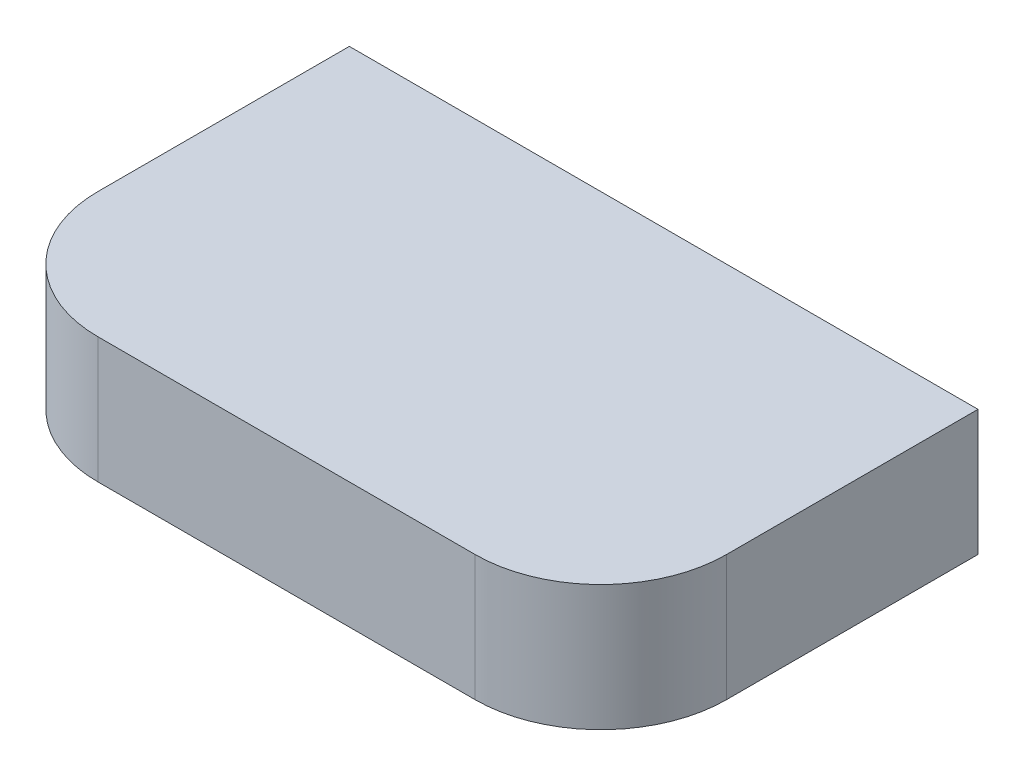
ISO-10303-21;
HEADER;
FILE_DESCRIPTION(('STEP AP214'),'2;1');
FILE_NAME('part.step','',(''),(''),'','','');
FILE_SCHEMA(('AUTOMOTIVE_DESIGN { 1 0 10303 214 1 1 1 1 }'));
ENDSEC;
DATA;
#1=APPLICATION_CONTEXT('core data for automotive mechanical design processes');
#2=APPLICATION_PROTOCOL_DEFINITION('international standard','automotive_design',2000,#1);
#3=PRODUCT_CONTEXT('',#1,'mechanical');
#4=PRODUCT('Part','Part','',(#3));
#5=PRODUCT_RELATED_PRODUCT_CATEGORY('part','',(#4));
#6=PRODUCT_DEFINITION_FORMATION('','',#4);
#7=PRODUCT_DEFINITION_CONTEXT('part definition',#1,'design');
#8=PRODUCT_DEFINITION('design','',#6,#7);
#9=PRODUCT_DEFINITION_SHAPE('','',#8);
#10=(LENGTH_UNIT() NAMED_UNIT(*) SI_UNIT(.MILLI.,.METRE.));
#11=(NAMED_UNIT(*) PLANE_ANGLE_UNIT() SI_UNIT($,.RADIAN.));
#12=(NAMED_UNIT(*) SI_UNIT($,.STERADIAN.) SOLID_ANGLE_UNIT());
#13=UNCERTAINTY_MEASURE_WITH_UNIT(LENGTH_MEASURE(1.E-05),#10,'distance_accuracy_value','');
#14=(GEOMETRIC_REPRESENTATION_CONTEXT(3) GLOBAL_UNCERTAINTY_ASSIGNED_CONTEXT((#13)) GLOBAL_UNIT_ASSIGNED_CONTEXT((#10,
#11,#12)) REPRESENTATION_CONTEXT('',''));
#15=CARTESIAN_POINT('',(0.,0.,0.));
#16=DIRECTION('',(0.,0.,1.));
#17=DIRECTION('',(1.,0.,0.));
#18=AXIS2_PLACEMENT_3D('',#15,#16,#17);
#19=CARTESIAN_POINT('',(0.,20.,0.));
#20=DIRECTION('',(1.,0.,0.));
#21=DIRECTION('',(0.,0.,-1.));
#22=AXIS2_PLACEMENT_3D('',#19,#20,#21);
#23=PLANE('',#22);
#24=DIRECTION('',(0.,0.,1.));
#25=VECTOR('',#24,1.);
#26=CARTESIAN_POINT('',(0.,0.,0.));
#27=LINE('',#26,#25);
#28=CARTESIAN_POINT('',(0.,0.,0.));
#29=VERTEX_POINT('',#28);
#30=CARTESIAN_POINT('',(0.,0.,40.));
#31=VERTEX_POINT('',#30);
#32=EDGE_CURVE('E126',#29,#31,#27,.T.);
#33=ORIENTED_EDGE('',*,*,#32,.T.);
#34=DIRECTION('',(0.,-1.,0.));
#35=VECTOR('',#34,1.);
#36=CARTESIAN_POINT('',(0.,20.,40.));
#37=LINE('',#36,#35);
#38=CARTESIAN_POINT('',(0.,20.,40.));
#39=VERTEX_POINT('',#38);
#40=EDGE_CURVE('E11',#31,#39,#37,.F.);
#41=ORIENTED_EDGE('',*,*,#40,.T.);
#42=DIRECTION('',(0.,0.,1.));
#43=VECTOR('',#42,1.);
#44=CARTESIAN_POINT('',(0.,20.,0.));
#45=LINE('',#44,#43);
#46=CARTESIAN_POINT('',(0.,20.,0.));
#47=VERTEX_POINT('',#46);
#48=EDGE_CURVE('E136',#47,#39,#45,.T.);
#49=ORIENTED_EDGE('',*,*,#48,.F.);
#50=DIRECTION('',(0.,-1.,0.));
#51=VECTOR('',#50,1.);
#52=CARTESIAN_POINT('',(0.,20.,0.));
#53=LINE('',#52,#51);
#54=EDGE_CURVE('E116',#47,#29,#53,.T.);
#55=ORIENTED_EDGE('',*,*,#54,.T.);
#56=EDGE_LOOP('',(#33,#41,#49,#55));
#57=FACE_BOUND('',#56,.T.);
#58=ADVANCED_FACE('F39',(#57),#23,.F.);
#59=CARTESIAN_POINT('',(0.,20.,60.));
#60=DIRECTION('',(0.,0.,-1.));
#61=DIRECTION('',(-1.,0.,0.));
#62=AXIS2_PLACEMENT_3D('',#59,#60,#61);
#63=PLANE('',#62);
#64=DIRECTION('',(1.,0.,0.));
#65=VECTOR('',#64,1.);
#66=CARTESIAN_POINT('',(0.,0.,60.));
#67=LINE('',#66,#65);
#68=CARTESIAN_POINT('',(20.,0.,60.));
#69=VERTEX_POINT('',#68);
#70=CARTESIAN_POINT('',(80.,0.,60.));
#71=VERTEX_POINT('',#70);
#72=EDGE_CURVE('E129',#69,#71,#67,.T.);
#73=ORIENTED_EDGE('',*,*,#72,.T.);
#74=DIRECTION('',(0.,-1.,0.));
#75=VECTOR('',#74,1.);
#76=CARTESIAN_POINT('',(80.,20.,60.));
#77=LINE('',#76,#75);
#78=CARTESIAN_POINT('',(80.,20.,60.));
#79=VERTEX_POINT('',#78);
#80=EDGE_CURVE('E61',#71,#79,#77,.F.);
#81=ORIENTED_EDGE('',*,*,#80,.T.);
#82=DIRECTION('',(1.,0.,0.));
#83=VECTOR('',#82,1.);
#84=CARTESIAN_POINT('',(0.,20.,60.));
#85=LINE('',#84,#83);
#86=CARTESIAN_POINT('',(20.,20.,60.));
#87=VERTEX_POINT('',#86);
#88=EDGE_CURVE('E105',#87,#79,#85,.T.);
#89=ORIENTED_EDGE('',*,*,#88,.F.);
#90=DIRECTION('',(0.,-1.,0.));
#91=VECTOR('',#90,1.);
#92=CARTESIAN_POINT('',(20.,20.,60.));
#93=LINE('',#92,#91);
#94=EDGE_CURVE('E146',#87,#69,#93,.T.);
#95=ORIENTED_EDGE('',*,*,#94,.T.);
#96=EDGE_LOOP('',(#73,#81,#89,#95));
#97=FACE_BOUND('',#96,.T.);
#98=ADVANCED_FACE('F158',(#97),#63,.F.);
#99=CARTESIAN_POINT('',(100.,20.,0.));
#100=DIRECTION('',(-1.,0.,0.));
#101=DIRECTION('',(0.,0.,1.));
#102=AXIS2_PLACEMENT_3D('',#99,#100,#101);
#103=PLANE('',#102);
#104=DIRECTION('',(0.,0.,-1.));
#105=VECTOR('',#104,1.);
#106=CARTESIAN_POINT('',(100.,20.,0.));
#107=LINE('',#106,#105);
#108=CARTESIAN_POINT('',(100.,20.,40.));
#109=VERTEX_POINT('',#108);
#110=CARTESIAN_POINT('',(100.,20.,0.));
#111=VERTEX_POINT('',#110);
#112=EDGE_CURVE('E94',#109,#111,#107,.T.);
#113=ORIENTED_EDGE('',*,*,#112,.F.);
#114=DIRECTION('',(0.,-1.,0.));
#115=VECTOR('',#114,1.);
#116=CARTESIAN_POINT('',(100.,20.,40.));
#117=LINE('',#116,#115);
#118=CARTESIAN_POINT('',(100.,0.,40.));
#119=VERTEX_POINT('',#118);
#120=EDGE_CURVE('E115',#109,#119,#117,.T.);
#121=ORIENTED_EDGE('',*,*,#120,.T.);
#122=DIRECTION('',(0.,0.,-1.));
#123=VECTOR('',#122,1.);
#124=CARTESIAN_POINT('',(100.,0.,0.));
#125=LINE('',#124,#123);
#126=CARTESIAN_POINT('',(100.,0.,0.));
#127=VERTEX_POINT('',#126);
#128=EDGE_CURVE('E111',#119,#127,#125,.T.);
#129=ORIENTED_EDGE('',*,*,#128,.T.);
#130=DIRECTION('',(0.,-1.,0.));
#131=VECTOR('',#130,1.);
#132=CARTESIAN_POINT('',(100.,20.,0.));
#133=LINE('',#132,#131);
#134=EDGE_CURVE('E108',#111,#127,#133,.T.);
#135=ORIENTED_EDGE('',*,*,#134,.F.);
#136=EDGE_LOOP('',(#113,#121,#129,#135));
#137=FACE_BOUND('',#136,.T.);
#138=ADVANCED_FACE('F109',(#137),#103,.F.);
#139=CARTESIAN_POINT('',(0.,20.,0.));
#140=DIRECTION('',(0.,0.,1.));
#141=DIRECTION('',(1.,0.,0.));
#142=AXIS2_PLACEMENT_3D('',#139,#140,#141);
#143=PLANE('',#142);
#144=DIRECTION('',(-1.,0.,0.));
#145=VECTOR('',#144,1.);
#146=CARTESIAN_POINT('',(0.,0.,0.));
#147=LINE('',#146,#145);
#148=EDGE_CURVE('E134',#127,#29,#147,.T.);
#149=ORIENTED_EDGE('',*,*,#148,.T.);
#150=ORIENTED_EDGE('',*,*,#54,.F.);
#151=DIRECTION('',(-1.,0.,0.));
#152=VECTOR('',#151,1.);
#153=CARTESIAN_POINT('',(0.,20.,0.));
#154=LINE('',#153,#152);
#155=EDGE_CURVE('E98',#111,#47,#154,.T.);
#156=ORIENTED_EDGE('',*,*,#155,.F.);
#157=ORIENTED_EDGE('',*,*,#134,.T.);
#158=EDGE_LOOP('',(#149,#150,#156,#157));
#159=FACE_BOUND('',#158,.T.);
#160=ADVANCED_FACE('F118',(#159),#143,.F.);
#161=CARTESIAN_POINT('',(0.,20.,0.));
#162=DIRECTION('',(0.,1.,0.));
#163=DIRECTION('',(0.,0.,1.));
#164=AXIS2_PLACEMENT_3D('',#161,#162,#163);
#165=PLANE('',#164);
#166=ORIENTED_EDGE('',*,*,#88,.T.);
#167=CARTESIAN_POINT('',(80.,20.,40.));
#168=DIRECTION('',(0.,1.,0.));
#169=DIRECTION('',(0.,0.,1.));
#170=AXIS2_PLACEMENT_3D('',#167,#168,#169);
#171=CIRCLE('',#170,20.);
#172=EDGE_CURVE('E48',#79,#109,#171,.T.);
#173=ORIENTED_EDGE('',*,*,#172,.T.);
#174=ORIENTED_EDGE('',*,*,#112,.T.);
#175=ORIENTED_EDGE('',*,*,#155,.T.);
#176=ORIENTED_EDGE('',*,*,#48,.T.);
#177=CARTESIAN_POINT('',(20.,20.,40.));
#178=DIRECTION('',(0.,1.,0.));
#179=DIRECTION('',(0.,0.,1.));
#180=AXIS2_PLACEMENT_3D('',#177,#178,#179);
#181=CIRCLE('',#180,20.);
#182=EDGE_CURVE('E152',#39,#87,#181,.T.);
#183=ORIENTED_EDGE('',*,*,#182,.T.);
#184=EDGE_LOOP('',(#166,#173,#174,#175,#176,#183));
#185=FACE_BOUND('',#184,.T.);
#186=ADVANCED_FACE('F96',(#185),#165,.T.);
#187=CARTESIAN_POINT('',(0.,0.,0.));
#188=DIRECTION('',(0.,1.,0.));
#189=DIRECTION('',(0.,0.,1.));
#190=AXIS2_PLACEMENT_3D('',#187,#188,#189);
#191=PLANE('',#190);
#192=ORIENTED_EDGE('',*,*,#128,.F.);
#193=CARTESIAN_POINT('',(80.,0.,40.));
#194=DIRECTION('',(0.,1.,0.));
#195=DIRECTION('',(0.,0.,1.));
#196=AXIS2_PLACEMENT_3D('',#193,#194,#195);
#197=CIRCLE('',#196,20.);
#198=EDGE_CURVE('E143',#119,#71,#197,.F.);
#199=ORIENTED_EDGE('',*,*,#198,.T.);
#200=ORIENTED_EDGE('',*,*,#72,.F.);
#201=CARTESIAN_POINT('',(20.,0.,40.));
#202=DIRECTION('',(0.,1.,0.));
#203=DIRECTION('',(0.,0.,1.));
#204=AXIS2_PLACEMENT_3D('',#201,#202,#203);
#205=CIRCLE('',#204,20.);
#206=EDGE_CURVE('E140',#69,#31,#205,.F.);
#207=ORIENTED_EDGE('',*,*,#206,.T.);
#208=ORIENTED_EDGE('',*,*,#32,.F.);
#209=ORIENTED_EDGE('',*,*,#148,.F.);
#210=EDGE_LOOP('',(#192,#199,#200,#207,#208,#209));
#211=FACE_BOUND('',#210,.T.);
#212=ADVANCED_FACE('F163',(#211),#191,.F.);
#213=CARTESIAN_POINT('',(80.,20.,40.));
#214=DIRECTION('',(0.,-1.,0.));
#215=DIRECTION('',(0.,0.,-1.));
#216=AXIS2_PLACEMENT_3D('',#213,#214,#215);
#217=CYLINDRICAL_SURFACE('',#216,20.);
#218=ORIENTED_EDGE('',*,*,#172,.F.);
#219=ORIENTED_EDGE('',*,*,#80,.F.);
#220=ORIENTED_EDGE('',*,*,#198,.F.);
#221=ORIENTED_EDGE('',*,*,#120,.F.);
#222=EDGE_LOOP('',(#218,#219,#220,#221));
#223=FACE_BOUND('',#222,.T.);
#224=ADVANCED_FACE('F173',(#223),#217,.T.);
#225=CARTESIAN_POINT('',(20.,20.,40.));
#226=DIRECTION('',(0.,-1.,0.));
#227=DIRECTION('',(0.,0.,-1.));
#228=AXIS2_PLACEMENT_3D('',#225,#226,#227);
#229=CYLINDRICAL_SURFACE('',#228,20.);
#230=ORIENTED_EDGE('',*,*,#182,.F.);
#231=ORIENTED_EDGE('',*,*,#40,.F.);
#232=ORIENTED_EDGE('',*,*,#206,.F.);
#233=ORIENTED_EDGE('',*,*,#94,.F.);
#234=EDGE_LOOP('',(#230,#231,#232,#233));
#235=FACE_BOUND('',#234,.T.);
#236=ADVANCED_FACE('F41',(#235),#229,.T.);
#237=CLOSED_SHELL('',(#58,#98,#138,#160,#186,#212,#224,#236));
#238=MANIFOLD_SOLID_BREP('B2',#237);
#239=ADVANCED_BREP_SHAPE_REPRESENTATION('',(#18,#238),#14);
#240=SHAPE_DEFINITION_REPRESENTATION(#9,#239);
ENDSEC;
END-ISO-10303-21;
